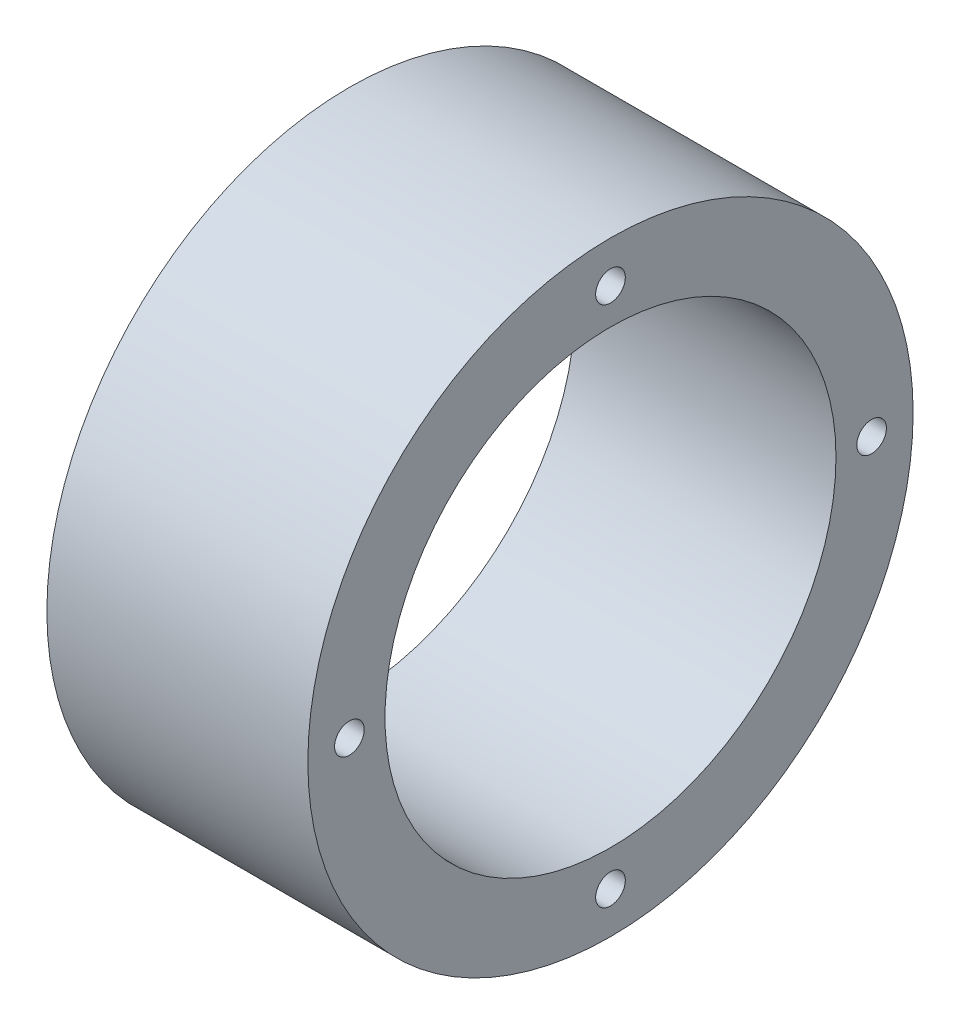
ISO-10303-21;
HEADER;
FILE_DESCRIPTION(('STEP AP214'),'2;1');
FILE_NAME('part.step','',(''),(''),'','','');
FILE_SCHEMA(('AUTOMOTIVE_DESIGN { 1 0 10303 214 1 1 1 1 }'));
ENDSEC;
DATA;
#1=APPLICATION_CONTEXT('core data for automotive mechanical design processes');
#2=APPLICATION_PROTOCOL_DEFINITION('international standard','automotive_design',2000,#1);
#3=PRODUCT_CONTEXT('',#1,'mechanical');
#4=PRODUCT('Part','Part','',(#3));
#5=PRODUCT_RELATED_PRODUCT_CATEGORY('part','',(#4));
#6=PRODUCT_DEFINITION_FORMATION('','',#4);
#7=PRODUCT_DEFINITION_CONTEXT('part definition',#1,'design');
#8=PRODUCT_DEFINITION('design','',#6,#7);
#9=PRODUCT_DEFINITION_SHAPE('','',#8);
#10=(LENGTH_UNIT() NAMED_UNIT(*) SI_UNIT(.MILLI.,.METRE.));
#11=(NAMED_UNIT(*) PLANE_ANGLE_UNIT() SI_UNIT($,.RADIAN.));
#12=(NAMED_UNIT(*) SI_UNIT($,.STERADIAN.) SOLID_ANGLE_UNIT());
#13=UNCERTAINTY_MEASURE_WITH_UNIT(LENGTH_MEASURE(1.E-05),#10,'distance_accuracy_value','');
#14=(GEOMETRIC_REPRESENTATION_CONTEXT(3) GLOBAL_UNCERTAINTY_ASSIGNED_CONTEXT((#13)) GLOBAL_UNIT_ASSIGNED_CONTEXT((#10,
#11,#12)) REPRESENTATION_CONTEXT('',''));
#15=CARTESIAN_POINT('',(0.,0.,0.));
#16=DIRECTION('',(0.,0.,1.));
#17=DIRECTION('',(1.,0.,0.));
#18=AXIS2_PLACEMENT_3D('',#15,#16,#17);
#19=CARTESIAN_POINT('',(193.98,0.,0.));
#20=DIRECTION('',(1.,0.,0.));
#21=DIRECTION('',(0.,0.,-1.));
#22=AXIS2_PLACEMENT_3D('',#19,#20,#21);
#23=PLANE('',#22);
#24=CARTESIAN_POINT('',(193.98,0.,0.));
#25=DIRECTION('',(1.,0.,0.));
#26=DIRECTION('',(0.,0.,-1.));
#27=AXIS2_PLACEMENT_3D('',#24,#25,#26);
#28=CIRCLE('',#27,51.);
#29=CARTESIAN_POINT('',(193.98,0.,-51.));
#30=VERTEX_POINT('',#29);
#31=EDGE_CURVE('E61',#30,#30,#28,.T.);
#32=ORIENTED_EDGE('',*,*,#31,.T.);
#33=EDGE_LOOP('',(#32));
#34=FACE_BOUND('',#33,.T.);
#35=CARTESIAN_POINT('',(193.98,0.,0.));
#36=DIRECTION('',(1.,0.,0.));
#37=DIRECTION('',(0.,0.,-1.));
#38=AXIS2_PLACEMENT_3D('',#35,#36,#37);
#39=CIRCLE('',#38,38.);
#40=CARTESIAN_POINT('',(193.98,0.,-38.));
#41=VERTEX_POINT('',#40);
#42=EDGE_CURVE('E55',#41,#41,#39,.T.);
#43=ORIENTED_EDGE('',*,*,#42,.F.);
#44=EDGE_LOOP('',(#43));
#45=FACE_BOUND('',#44,.T.);
#46=CARTESIAN_POINT('',(193.98,-44.,2.31588441170336E-12));
#47=DIRECTION('',(1.,0.,0.));
#48=DIRECTION('',(0.,0.,-1.));
#49=AXIS2_PLACEMENT_3D('',#46,#47,#48);
#50=CIRCLE('',#49,2.50000000000249);
#51=CARTESIAN_POINT('',(193.98,-44.,-2.50000000000018));
#52=VERTEX_POINT('',#51);
#53=EDGE_CURVE('E67',#52,#52,#50,.F.);
#54=ORIENTED_EDGE('',*,*,#53,.T.);
#55=EDGE_LOOP('',(#54));
#56=FACE_BOUND('',#55,.T.);
#57=CARTESIAN_POINT('',(193.98,44.,0.));
#58=DIRECTION('',(1.,0.,0.));
#59=DIRECTION('',(0.,0.,-1.));
#60=AXIS2_PLACEMENT_3D('',#57,#58,#59);
#61=CIRCLE('',#60,2.50000000000249);
#62=CARTESIAN_POINT('',(193.98,44.,-2.50000000000249));
#63=VERTEX_POINT('',#62);
#64=EDGE_CURVE('E38',#63,#63,#61,.F.);
#65=ORIENTED_EDGE('',*,*,#64,.T.);
#66=EDGE_LOOP('',(#65));
#67=FACE_BOUND('',#66,.T.);
#68=CARTESIAN_POINT('',(193.98,1.15794220585168E-12,44.0000000000012));
#69=DIRECTION('',(1.,0.,0.));
#70=DIRECTION('',(0.,0.,-1.));
#71=AXIS2_PLACEMENT_3D('',#68,#69,#70);
#72=CIRCLE('',#71,2.50000000000249);
#73=CARTESIAN_POINT('',(193.98,1.15794220585168E-12,41.4999999999987));
#74=VERTEX_POINT('',#73);
#75=EDGE_CURVE('E69',#74,#74,#72,.F.);
#76=ORIENTED_EDGE('',*,*,#75,.T.);
#77=EDGE_LOOP('',(#76));
#78=FACE_BOUND('',#77,.T.);
#79=CARTESIAN_POINT('',(193.98,-1.16333065176793E-12,-43.9999999999988));
#80=DIRECTION('',(1.,0.,0.));
#81=DIRECTION('',(0.,0.,-1.));
#82=AXIS2_PLACEMENT_3D('',#79,#80,#81);
#83=CIRCLE('',#82,2.50000000000248);
#84=CARTESIAN_POINT('',(193.98,-1.16333065176793E-12,-46.5000000000013));
#85=VERTEX_POINT('',#84);
#86=EDGE_CURVE('E64',#85,#85,#83,.F.);
#87=ORIENTED_EDGE('',*,*,#86,.T.);
#88=EDGE_LOOP('',(#87));
#89=FACE_BOUND('',#88,.T.);
#90=ADVANCED_FACE('F34',(#34,#45,#56,#67,#78,#89),#23,.T.);
#91=CARTESIAN_POINT('',(213.98,0.,0.));
#92=DIRECTION('',(-1.,0.,0.));
#93=DIRECTION('',(0.,0.,1.));
#94=AXIS2_PLACEMENT_3D('',#91,#92,#93);
#95=CYLINDRICAL_SURFACE('',#94,51.);
#96=CARTESIAN_POINT('',(150.,0.,0.));
#97=DIRECTION('',(1.,0.,0.));
#98=DIRECTION('',(0.,0.,-1.));
#99=AXIS2_PLACEMENT_3D('',#96,#97,#98);
#100=CIRCLE('',#99,51.);
#101=CARTESIAN_POINT('',(150.,0.,-51.));
#102=VERTEX_POINT('',#101);
#103=EDGE_CURVE('E51',#102,#102,#100,.T.);
#104=ORIENTED_EDGE('',*,*,#103,.T.);
#105=EDGE_LOOP('',(#104));
#106=FACE_BOUND('',#105,.T.);
#107=ORIENTED_EDGE('',*,*,#31,.F.);
#108=EDGE_LOOP('',(#107));
#109=FACE_BOUND('',#108,.T.);
#110=ADVANCED_FACE('F36',(#106,#109),#95,.T.);
#111=CARTESIAN_POINT('',(213.98,0.,0.));
#112=DIRECTION('',(-1.,0.,0.));
#113=DIRECTION('',(0.,0.,1.));
#114=AXIS2_PLACEMENT_3D('',#111,#112,#113);
#115=CYLINDRICAL_SURFACE('',#114,38.);
#116=CARTESIAN_POINT('',(150.,0.,0.));
#117=DIRECTION('',(1.,0.,0.));
#118=DIRECTION('',(0.,0.,-1.));
#119=AXIS2_PLACEMENT_3D('',#116,#117,#118);
#120=CIRCLE('',#119,38.);
#121=CARTESIAN_POINT('',(150.,0.,-38.));
#122=VERTEX_POINT('',#121);
#123=EDGE_CURVE('E54',#122,#122,#120,.T.);
#124=ORIENTED_EDGE('',*,*,#123,.F.);
#125=EDGE_LOOP('',(#124));
#126=FACE_BOUND('',#125,.T.);
#127=ORIENTED_EDGE('',*,*,#42,.T.);
#128=EDGE_LOOP('',(#127));
#129=FACE_BOUND('',#128,.T.);
#130=ADVANCED_FACE('F95',(#126,#129),#115,.F.);
#131=CARTESIAN_POINT('',(221.051067811873,-1.16333065176793E-12,-43.9999999999988));
#132=DIRECTION('',(-1.,0.,0.));
#133=DIRECTION('',(0.,0.,1.));
#134=AXIS2_PLACEMENT_3D('',#131,#132,#133);
#135=CYLINDRICAL_SURFACE('',#134,2.50000000000248);
#136=CARTESIAN_POINT('',(150.,-1.16333065176793E-12,-43.9999999999988));
#137=DIRECTION('',(1.,0.,0.));
#138=DIRECTION('',(0.,0.,-1.));
#139=AXIS2_PLACEMENT_3D('',#136,#137,#138);
#140=CIRCLE('',#139,2.50000000000248);
#141=CARTESIAN_POINT('',(150.,-1.16333065176793E-12,-46.5000000000013));
#142=VERTEX_POINT('',#141);
#143=EDGE_CURVE('E10',#142,#142,#140,.T.);
#144=ORIENTED_EDGE('',*,*,#143,.F.);
#145=EDGE_LOOP('',(#144));
#146=FACE_BOUND('',#145,.T.);
#147=ORIENTED_EDGE('',*,*,#86,.F.);
#148=EDGE_LOOP('',(#147));
#149=FACE_BOUND('',#148,.T.);
#150=ADVANCED_FACE('F101',(#146,#149),#135,.F.);
#151=CARTESIAN_POINT('',(221.051067811873,-44.,2.31588441170336E-12));
#152=DIRECTION('',(-1.,0.,0.));
#153=DIRECTION('',(0.,0.,1.));
#154=AXIS2_PLACEMENT_3D('',#151,#152,#153);
#155=CYLINDRICAL_SURFACE('',#154,2.50000000000249);
#156=CARTESIAN_POINT('',(150.,-44.,2.31588441170336E-12));
#157=DIRECTION('',(1.,0.,0.));
#158=DIRECTION('',(0.,0.,-1.));
#159=AXIS2_PLACEMENT_3D('',#156,#157,#158);
#160=CIRCLE('',#159,2.50000000000249);
#161=CARTESIAN_POINT('',(150.,-44.,-2.50000000000018));
#162=VERTEX_POINT('',#161);
#163=EDGE_CURVE('E42',#162,#162,#160,.T.);
#164=ORIENTED_EDGE('',*,*,#163,.F.);
#165=EDGE_LOOP('',(#164));
#166=FACE_BOUND('',#165,.T.);
#167=ORIENTED_EDGE('',*,*,#53,.F.);
#168=EDGE_LOOP('',(#167));
#169=FACE_BOUND('',#168,.T.);
#170=ADVANCED_FACE('F89',(#166,#169),#155,.F.);
#171=CARTESIAN_POINT('',(221.051067811873,1.15794220585168E-12,44.0000000000012));
#172=DIRECTION('',(-1.,0.,0.));
#173=DIRECTION('',(0.,0.,1.));
#174=AXIS2_PLACEMENT_3D('',#171,#172,#173);
#175=CYLINDRICAL_SURFACE('',#174,2.50000000000249);
#176=CARTESIAN_POINT('',(150.,1.15794220585168E-12,44.0000000000012));
#177=DIRECTION('',(1.,0.,0.));
#178=DIRECTION('',(0.,0.,-1.));
#179=AXIS2_PLACEMENT_3D('',#176,#177,#178);
#180=CIRCLE('',#179,2.50000000000249);
#181=CARTESIAN_POINT('',(150.,1.15794220585168E-12,41.4999999999987));
#182=VERTEX_POINT('',#181);
#183=EDGE_CURVE('E47',#182,#182,#180,.T.);
#184=ORIENTED_EDGE('',*,*,#183,.F.);
#185=EDGE_LOOP('',(#184));
#186=FACE_BOUND('',#185,.T.);
#187=ORIENTED_EDGE('',*,*,#75,.F.);
#188=EDGE_LOOP('',(#187));
#189=FACE_BOUND('',#188,.T.);
#190=ADVANCED_FACE('F80',(#186,#189),#175,.F.);
#191=CARTESIAN_POINT('',(221.051067811873,44.,0.));
#192=DIRECTION('',(-1.,0.,0.));
#193=DIRECTION('',(0.,0.,1.));
#194=AXIS2_PLACEMENT_3D('',#191,#192,#193);
#195=CYLINDRICAL_SURFACE('',#194,2.50000000000249);
#196=CARTESIAN_POINT('',(150.,44.,0.));
#197=DIRECTION('',(1.,0.,0.));
#198=DIRECTION('',(0.,0.,-1.));
#199=AXIS2_PLACEMENT_3D('',#196,#197,#198);
#200=CIRCLE('',#199,2.50000000000249);
#201=CARTESIAN_POINT('',(150.,44.,-2.50000000000249));
#202=VERTEX_POINT('',#201);
#203=EDGE_CURVE('E58',#202,#202,#200,.T.);
#204=ORIENTED_EDGE('',*,*,#203,.F.);
#205=EDGE_LOOP('',(#204));
#206=FACE_BOUND('',#205,.T.);
#207=ORIENTED_EDGE('',*,*,#64,.F.);
#208=EDGE_LOOP('',(#207));
#209=FACE_BOUND('',#208,.T.);
#210=ADVANCED_FACE('F77',(#206,#209),#195,.F.);
#211=CARTESIAN_POINT('',(150.,0.,0.));
#212=DIRECTION('',(1.,0.,0.));
#213=DIRECTION('',(0.,0.,-1.));
#214=AXIS2_PLACEMENT_3D('',#211,#212,#213);
#215=PLANE('',#214);
#216=ORIENTED_EDGE('',*,*,#203,.T.);
#217=EDGE_LOOP('',(#216));
#218=FACE_BOUND('',#217,.T.);
#219=ORIENTED_EDGE('',*,*,#183,.T.);
#220=EDGE_LOOP('',(#219));
#221=FACE_BOUND('',#220,.T.);
#222=ORIENTED_EDGE('',*,*,#163,.T.);
#223=EDGE_LOOP('',(#222));
#224=FACE_BOUND('',#223,.T.);
#225=ORIENTED_EDGE('',*,*,#143,.T.);
#226=EDGE_LOOP('',(#225));
#227=FACE_BOUND('',#226,.T.);
#228=ORIENTED_EDGE('',*,*,#103,.F.);
#229=EDGE_LOOP('',(#228));
#230=FACE_BOUND('',#229,.T.);
#231=ORIENTED_EDGE('',*,*,#123,.T.);
#232=EDGE_LOOP('',(#231));
#233=FACE_BOUND('',#232,.T.);
#234=ADVANCED_FACE('F79',(#218,#221,#224,#227,#230,#233),#215,.F.);
#235=CLOSED_SHELL('',(#90,#110,#130,#150,#170,#190,#210,#234));
#236=MANIFOLD_SOLID_BREP('B2',#235);
#237=ADVANCED_BREP_SHAPE_REPRESENTATION('',(#18,#236),#14);
#238=SHAPE_DEFINITION_REPRESENTATION(#9,#237);
ENDSEC;
END-ISO-10303-21;
